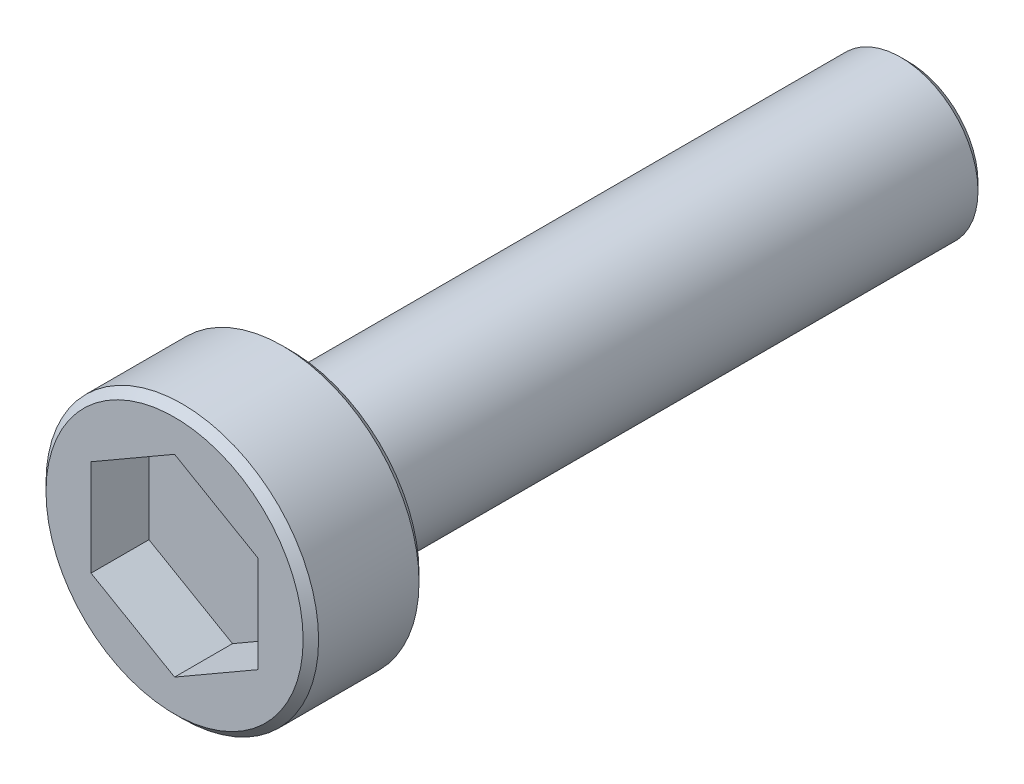
ISO-10303-21;
HEADER;
FILE_DESCRIPTION(('STEP AP214'),'2;1');
FILE_NAME('part.step','',(''),(''),'','','');
FILE_SCHEMA(('AUTOMOTIVE_DESIGN { 1 0 10303 214 1 1 1 1 }'));
ENDSEC;
DATA;
#1=APPLICATION_CONTEXT('core data for automotive mechanical design processes');
#2=APPLICATION_PROTOCOL_DEFINITION('international standard','automotive_design',2000,#1);
#3=PRODUCT_CONTEXT('',#1,'mechanical');
#4=PRODUCT('Part','Part','',(#3));
#5=PRODUCT_RELATED_PRODUCT_CATEGORY('part','',(#4));
#6=PRODUCT_DEFINITION_FORMATION('','',#4);
#7=PRODUCT_DEFINITION_CONTEXT('part definition',#1,'design');
#8=PRODUCT_DEFINITION('design','',#6,#7);
#9=PRODUCT_DEFINITION_SHAPE('','',#8);
#10=(LENGTH_UNIT() NAMED_UNIT(*) SI_UNIT(.MILLI.,.METRE.));
#11=(NAMED_UNIT(*) PLANE_ANGLE_UNIT() SI_UNIT($,.RADIAN.));
#12=(NAMED_UNIT(*) SI_UNIT($,.STERADIAN.) SOLID_ANGLE_UNIT());
#13=UNCERTAINTY_MEASURE_WITH_UNIT(LENGTH_MEASURE(1.E-05),#10,'distance_accuracy_value','');
#14=(GEOMETRIC_REPRESENTATION_CONTEXT(3) GLOBAL_UNCERTAINTY_ASSIGNED_CONTEXT((#13)) GLOBAL_UNIT_ASSIGNED_CONTEXT((#10,
#11,#12)) REPRESENTATION_CONTEXT('',''));
#15=CARTESIAN_POINT('',(0.,0.,0.));
#16=DIRECTION('',(0.,0.,1.));
#17=DIRECTION('',(1.,0.,0.));
#18=AXIS2_PLACEMENT_3D('',#15,#16,#17);
#19=CARTESIAN_POINT('',(0.,0.,16.));
#20=DIRECTION('',(0.,0.,-1.));
#21=DIRECTION('',(-1.,0.,0.));
#22=AXIS2_PLACEMENT_3D('',#19,#20,#21);
#23=CYLINDRICAL_SURFACE('',#22,2.);
#24=CARTESIAN_POINT('',(0.,0.,0.199999999999999));
#25=DIRECTION('',(0.,0.,1.));
#26=DIRECTION('',(1.,0.,0.));
#27=AXIS2_PLACEMENT_3D('',#24,#25,#26);
#28=CIRCLE('',#27,2.);
#29=CARTESIAN_POINT('',(2.,0.,0.199999999999999));
#30=VERTEX_POINT('',#29);
#31=EDGE_CURVE('E149',#30,#30,#28,.T.);
#32=ORIENTED_EDGE('',*,*,#31,.T.);
#33=EDGE_LOOP('',(#32));
#34=FACE_BOUND('',#33,.T.);
#35=CARTESIAN_POINT('',(0.,0.,16.));
#36=DIRECTION('',(0.,0.,1.));
#37=DIRECTION('',(1.,0.,0.));
#38=AXIS2_PLACEMENT_3D('',#35,#36,#37);
#39=CIRCLE('',#38,2.);
#40=CARTESIAN_POINT('',(2.,0.,16.));
#41=VERTEX_POINT('',#40);
#42=EDGE_CURVE('E141',#41,#41,#39,.T.);
#43=ORIENTED_EDGE('',*,*,#42,.F.);
#44=EDGE_LOOP('',(#43));
#45=FACE_BOUND('',#44,.T.);
#46=ADVANCED_FACE('F39',(#34,#45),#23,.T.);
#47=CARTESIAN_POINT('',(0.,0.,0.));
#48=DIRECTION('',(0.,0.,1.));
#49=DIRECTION('',(1.,0.,0.));
#50=AXIS2_PLACEMENT_3D('',#47,#48,#49);
#51=PLANE('',#50);
#52=CARTESIAN_POINT('',(0.,0.,0.));
#53=DIRECTION('',(0.,0.,1.));
#54=DIRECTION('',(1.,0.,0.));
#55=AXIS2_PLACEMENT_3D('',#52,#53,#54);
#56=CIRCLE('',#55,1.8);
#57=CARTESIAN_POINT('',(1.8,0.,0.));
#58=VERTEX_POINT('',#57);
#59=EDGE_CURVE('E152',#58,#58,#56,.F.);
#60=ORIENTED_EDGE('',*,*,#59,.T.);
#61=EDGE_LOOP('',(#60));
#62=FACE_BOUND('',#61,.T.);
#63=ADVANCED_FACE('F196',(#62),#51,.F.);
#64=CARTESIAN_POINT('',(0.,0.,19.));
#65=DIRECTION('',(0.,0.,-1.));
#66=DIRECTION('',(-1.,0.,0.));
#67=AXIS2_PLACEMENT_3D('',#64,#65,#66);
#68=CYLINDRICAL_SURFACE('',#67,3.52854216956388);
#69=CARTESIAN_POINT('',(0.,0.,18.8));
#70=DIRECTION('',(0.,0.,1.));
#71=DIRECTION('',(1.,0.,0.));
#72=AXIS2_PLACEMENT_3D('',#69,#70,#71);
#73=CIRCLE('',#72,3.52854216956388);
#74=CARTESIAN_POINT('',(3.52854216956388,0.,18.8));
#75=VERTEX_POINT('',#74);
#76=EDGE_CURVE('E47',#75,#75,#73,.F.);
#77=ORIENTED_EDGE('',*,*,#76,.T.);
#78=EDGE_LOOP('',(#77));
#79=FACE_BOUND('',#78,.T.);
#80=CARTESIAN_POINT('',(0.,0.,16.2));
#81=DIRECTION('',(0.,0.,1.));
#82=DIRECTION('',(1.,0.,0.));
#83=AXIS2_PLACEMENT_3D('',#80,#81,#82);
#84=CIRCLE('',#83,3.52854216956388);
#85=CARTESIAN_POINT('',(3.52854216956388,0.,16.2));
#86=VERTEX_POINT('',#85);
#87=EDGE_CURVE('E158',#86,#86,#84,.T.);
#88=ORIENTED_EDGE('',*,*,#87,.T.);
#89=EDGE_LOOP('',(#88));
#90=FACE_BOUND('',#89,.T.);
#91=ADVANCED_FACE('F163',(#79,#90),#68,.T.);
#92=CARTESIAN_POINT('',(0.,0.,19.));
#93=DIRECTION('',(0.,0.,1.));
#94=DIRECTION('',(1.,0.,0.));
#95=AXIS2_PLACEMENT_3D('',#92,#93,#94);
#96=PLANE('',#95);
#97=CARTESIAN_POINT('',(0.,0.,19.));
#98=DIRECTION('',(0.,0.,1.));
#99=DIRECTION('',(1.,0.,0.));
#100=AXIS2_PLACEMENT_3D('',#97,#98,#99);
#101=CIRCLE('',#100,3.32854216956388);
#102=CARTESIAN_POINT('',(3.32854216956388,0.,19.));
#103=VERTEX_POINT('',#102);
#104=EDGE_CURVE('E155',#103,#103,#101,.T.);
#105=ORIENTED_EDGE('',*,*,#104,.T.);
#106=EDGE_LOOP('',(#105));
#107=FACE_BOUND('',#106,.T.);
#108=DIRECTION('',(-0.866025403784441,0.499999999999995,0.));
#109=VECTOR('',#108,1.);
#110=CARTESIAN_POINT('',(2.16306090746615,1.24884379719917,19.));
#111=LINE('',#110,#109);
#112=CARTESIAN_POINT('',(2.16306090746615,1.24884379719917,19.));
#113=VERTEX_POINT('',#112);
#114=CARTESIAN_POINT('',(0.,2.49768759439829,19.));
#115=VERTEX_POINT('',#114);
#116=EDGE_CURVE('E54',#113,#115,#111,.T.);
#117=ORIENTED_EDGE('',*,*,#116,.F.);
#118=DIRECTION('',(0.,1.,0.));
#119=VECTOR('',#118,1.);
#120=CARTESIAN_POINT('',(2.16306090746617,-1.24884379719912,19.));
#121=LINE('',#120,#119);
#122=CARTESIAN_POINT('',(2.16306090746617,-1.24884379719912,19.));
#123=VERTEX_POINT('',#122);
#124=EDGE_CURVE('E137',#123,#113,#121,.T.);
#125=ORIENTED_EDGE('',*,*,#124,.F.);
#126=DIRECTION('',(0.866025403784435,0.500000000000007,0.));
#127=VECTOR('',#126,1.);
#128=CARTESIAN_POINT('',(0.,-2.49768759439829,19.));
#129=LINE('',#128,#127);
#130=CARTESIAN_POINT('',(0.,-2.49768759439829,19.));
#131=VERTEX_POINT('',#130);
#132=EDGE_CURVE('E135',#131,#123,#129,.T.);
#133=ORIENTED_EDGE('',*,*,#132,.F.);
#134=DIRECTION('',(0.866025403784442,-0.499999999999995,0.));
#135=VECTOR('',#134,1.);
#136=CARTESIAN_POINT('',(-2.16306090746615,-1.24884379719915,19.));
#137=LINE('',#136,#135);
#138=CARTESIAN_POINT('',(-2.16306090746615,-1.24884379719915,19.));
#139=VERTEX_POINT('',#138);
#140=EDGE_CURVE('E102',#139,#131,#137,.T.);
#141=ORIENTED_EDGE('',*,*,#140,.F.);
#142=DIRECTION('',(0.,-1.,0.));
#143=VECTOR('',#142,1.);
#144=CARTESIAN_POINT('',(-2.16306090746616,1.24884379719914,19.));
#145=LINE('',#144,#143);
#146=CARTESIAN_POINT('',(-2.16306090746616,1.24884379719914,19.));
#147=VERTEX_POINT('',#146);
#148=EDGE_CURVE('E131',#147,#139,#145,.T.);
#149=ORIENTED_EDGE('',*,*,#148,.F.);
#150=DIRECTION('',(-0.866025403784438,-0.500000000000001,0.));
#151=VECTOR('',#150,1.);
#152=CARTESIAN_POINT('',(0.,2.49768759439829,19.));
#153=LINE('',#152,#151);
#154=EDGE_CURVE('E128',#115,#147,#153,.T.);
#155=ORIENTED_EDGE('',*,*,#154,.F.);
#156=EDGE_LOOP('',(#117,#125,#133,#141,#149,#155));
#157=FACE_BOUND('',#156,.T.);
#158=ADVANCED_FACE('F172',(#107,#157),#96,.T.);
#159=CARTESIAN_POINT('',(0.,0.,16.));
#160=DIRECTION('',(0.,0.,1.));
#161=DIRECTION('',(1.,0.,0.));
#162=AXIS2_PLACEMENT_3D('',#159,#160,#161);
#163=PLANE('',#162);
#164=CARTESIAN_POINT('',(0.,0.,16.));
#165=DIRECTION('',(0.,0.,1.));
#166=DIRECTION('',(1.,0.,0.));
#167=AXIS2_PLACEMENT_3D('',#164,#165,#166);
#168=CIRCLE('',#167,3.32854216956388);
#169=CARTESIAN_POINT('',(3.32854216956388,0.,16.));
#170=VERTEX_POINT('',#169);
#171=EDGE_CURVE('E11',#170,#170,#168,.F.);
#172=ORIENTED_EDGE('',*,*,#171,.T.);
#173=EDGE_LOOP('',(#172));
#174=FACE_BOUND('',#173,.T.);
#175=ORIENTED_EDGE('',*,*,#42,.T.);
#176=EDGE_LOOP('',(#175));
#177=FACE_BOUND('',#176,.T.);
#178=ADVANCED_FACE('F175',(#174,#177),#163,.F.);
#179=CARTESIAN_POINT('',(2.16306090746615,1.24884379719917,17.5));
#180=DIRECTION('',(0.499999999999995,0.866025403784442,0.));
#181=DIRECTION('',(-0.866025403784442,0.499999999999995,0.));
#182=AXIS2_PLACEMENT_3D('',#179,#180,#181);
#183=PLANE('',#182);
#184=ORIENTED_EDGE('',*,*,#116,.T.);
#185=DIRECTION('',(0.,0.,1.));
#186=VECTOR('',#185,1.);
#187=CARTESIAN_POINT('',(0.,2.49768759439829,17.5));
#188=LINE('',#187,#186);
#189=CARTESIAN_POINT('',(0.,2.49768759439829,17.5));
#190=VERTEX_POINT('',#189);
#191=EDGE_CURVE('E84',#190,#115,#188,.T.);
#192=ORIENTED_EDGE('',*,*,#191,.F.);
#193=DIRECTION('',(-0.866025403784441,0.499999999999995,0.));
#194=VECTOR('',#193,1.);
#195=CARTESIAN_POINT('',(2.16306090746615,1.24884379719917,17.5));
#196=LINE('',#195,#194);
#197=CARTESIAN_POINT('',(2.16306090746615,1.24884379719917,17.5));
#198=VERTEX_POINT('',#197);
#199=EDGE_CURVE('E139',#198,#190,#196,.T.);
#200=ORIENTED_EDGE('',*,*,#199,.F.);
#201=DIRECTION('',(0.,0.,1.));
#202=VECTOR('',#201,1.);
#203=CARTESIAN_POINT('',(2.16306090746615,1.24884379719917,17.5));
#204=LINE('',#203,#202);
#205=EDGE_CURVE('E62',#198,#113,#204,.T.);
#206=ORIENTED_EDGE('',*,*,#205,.T.);
#207=EDGE_LOOP('',(#184,#192,#200,#206));
#208=FACE_BOUND('',#207,.T.);
#209=ADVANCED_FACE('F183',(#208),#183,.F.);
#210=CARTESIAN_POINT('',(2.16306090746617,-1.24884379719912,17.5));
#211=DIRECTION('',(1.,0.,0.));
#212=DIRECTION('',(0.,1.,0.));
#213=AXIS2_PLACEMENT_3D('',#210,#211,#212);
#214=PLANE('',#213);
#215=ORIENTED_EDGE('',*,*,#124,.T.);
#216=ORIENTED_EDGE('',*,*,#205,.F.);
#217=DIRECTION('',(0.,1.,0.));
#218=VECTOR('',#217,1.);
#219=CARTESIAN_POINT('',(2.16306090746617,-1.24884379719912,17.5));
#220=LINE('',#219,#218);
#221=CARTESIAN_POINT('',(2.16306090746617,-1.24884379719912,17.5));
#222=VERTEX_POINT('',#221);
#223=EDGE_CURVE('E114',#222,#198,#220,.T.);
#224=ORIENTED_EDGE('',*,*,#223,.F.);
#225=DIRECTION('',(0.,0.,1.));
#226=VECTOR('',#225,1.);
#227=CARTESIAN_POINT('',(2.16306090746617,-1.24884379719912,17.5));
#228=LINE('',#227,#226);
#229=EDGE_CURVE('E106',#222,#123,#228,.T.);
#230=ORIENTED_EDGE('',*,*,#229,.T.);
#231=EDGE_LOOP('',(#215,#216,#224,#230));
#232=FACE_BOUND('',#231,.T.);
#233=ADVANCED_FACE('F185',(#232),#214,.F.);
#234=CARTESIAN_POINT('',(0.,-2.49768759439829,17.5));
#235=DIRECTION('',(0.500000000000007,-0.866025403784434,0.));
#236=DIRECTION('',(0.866025403784435,0.500000000000007,0.));
#237=AXIS2_PLACEMENT_3D('',#234,#235,#236);
#238=PLANE('',#237);
#239=ORIENTED_EDGE('',*,*,#132,.T.);
#240=ORIENTED_EDGE('',*,*,#229,.F.);
#241=DIRECTION('',(0.866025403784435,0.500000000000007,0.));
#242=VECTOR('',#241,1.);
#243=CARTESIAN_POINT('',(0.,-2.49768759439829,17.5));
#244=LINE('',#243,#242);
#245=CARTESIAN_POINT('',(0.,-2.49768759439829,17.5));
#246=VERTEX_POINT('',#245);
#247=EDGE_CURVE('E110',#246,#222,#244,.T.);
#248=ORIENTED_EDGE('',*,*,#247,.F.);
#249=DIRECTION('',(0.,0.,1.));
#250=VECTOR('',#249,1.);
#251=CARTESIAN_POINT('',(0.,-2.49768759439829,17.5));
#252=LINE('',#251,#250);
#253=EDGE_CURVE('E95',#246,#131,#252,.T.);
#254=ORIENTED_EDGE('',*,*,#253,.T.);
#255=EDGE_LOOP('',(#239,#240,#248,#254));
#256=FACE_BOUND('',#255,.T.);
#257=ADVANCED_FACE('F111',(#256),#238,.F.);
#258=CARTESIAN_POINT('',(-2.16306090746615,-1.24884379719915,17.5));
#259=DIRECTION('',(-0.499999999999995,-0.866025403784441,0.));
#260=DIRECTION('',(0.866025403784442,-0.499999999999995,0.));
#261=AXIS2_PLACEMENT_3D('',#258,#259,#260);
#262=PLANE('',#261);
#263=ORIENTED_EDGE('',*,*,#140,.T.);
#264=ORIENTED_EDGE('',*,*,#253,.F.);
#265=DIRECTION('',(0.866025403784442,-0.499999999999995,0.));
#266=VECTOR('',#265,1.);
#267=CARTESIAN_POINT('',(-2.16306090746615,-1.24884379719915,17.5));
#268=LINE('',#267,#266);
#269=CARTESIAN_POINT('',(-2.16306090746615,-1.24884379719915,17.5));
#270=VERTEX_POINT('',#269);
#271=EDGE_CURVE('E99',#270,#246,#268,.T.);
#272=ORIENTED_EDGE('',*,*,#271,.F.);
#273=DIRECTION('',(0.,0.,1.));
#274=VECTOR('',#273,1.);
#275=CARTESIAN_POINT('',(-2.16306090746615,-1.24884379719915,17.5));
#276=LINE('',#275,#274);
#277=EDGE_CURVE('E107',#270,#139,#276,.T.);
#278=ORIENTED_EDGE('',*,*,#277,.T.);
#279=EDGE_LOOP('',(#263,#264,#272,#278));
#280=FACE_BOUND('',#279,.T.);
#281=ADVANCED_FACE('F97',(#280),#262,.F.);
#282=CARTESIAN_POINT('',(-2.16306090746616,1.24884379719914,17.5));
#283=DIRECTION('',(-1.,0.,0.));
#284=DIRECTION('',(0.,-1.,0.));
#285=AXIS2_PLACEMENT_3D('',#282,#283,#284);
#286=PLANE('',#285);
#287=ORIENTED_EDGE('',*,*,#148,.T.);
#288=ORIENTED_EDGE('',*,*,#277,.F.);
#289=DIRECTION('',(0.,-1.,0.));
#290=VECTOR('',#289,1.);
#291=CARTESIAN_POINT('',(-2.16306090746616,1.24884379719914,17.5));
#292=LINE('',#291,#290);
#293=CARTESIAN_POINT('',(-2.16306090746616,1.24884379719914,17.5));
#294=VERTEX_POINT('',#293);
#295=EDGE_CURVE('E120',#294,#270,#292,.T.);
#296=ORIENTED_EDGE('',*,*,#295,.F.);
#297=DIRECTION('',(0.,0.,1.));
#298=VECTOR('',#297,1.);
#299=CARTESIAN_POINT('',(-2.16306090746616,1.24884379719914,17.5));
#300=LINE('',#299,#298);
#301=EDGE_CURVE('E144',#294,#147,#300,.T.);
#302=ORIENTED_EDGE('',*,*,#301,.T.);
#303=EDGE_LOOP('',(#287,#288,#296,#302));
#304=FACE_BOUND('',#303,.T.);
#305=ADVANCED_FACE('F219',(#304),#286,.F.);
#306=CARTESIAN_POINT('',(0.,2.49768759439829,17.5));
#307=DIRECTION('',(-0.500000000000001,0.866025403784438,0.));
#308=DIRECTION('',(-0.866025403784438,-0.500000000000001,0.));
#309=AXIS2_PLACEMENT_3D('',#306,#307,#308);
#310=PLANE('',#309);
#311=ORIENTED_EDGE('',*,*,#154,.T.);
#312=ORIENTED_EDGE('',*,*,#301,.F.);
#313=DIRECTION('',(-0.866025403784438,-0.500000000000001,0.));
#314=VECTOR('',#313,1.);
#315=CARTESIAN_POINT('',(0.,2.49768759439829,17.5));
#316=LINE('',#315,#314);
#317=EDGE_CURVE('E122',#190,#294,#316,.T.);
#318=ORIENTED_EDGE('',*,*,#317,.F.);
#319=ORIENTED_EDGE('',*,*,#191,.T.);
#320=EDGE_LOOP('',(#311,#312,#318,#319));
#321=FACE_BOUND('',#320,.T.);
#322=ADVANCED_FACE('F181',(#321),#310,.F.);
#323=CARTESIAN_POINT('',(0.,0.,17.5));
#324=DIRECTION('',(0.,0.,1.));
#325=DIRECTION('',(1.,0.,0.));
#326=AXIS2_PLACEMENT_3D('',#323,#324,#325);
#327=PLANE('',#326);
#328=ORIENTED_EDGE('',*,*,#199,.T.);
#329=ORIENTED_EDGE('',*,*,#317,.T.);
#330=ORIENTED_EDGE('',*,*,#295,.T.);
#331=ORIENTED_EDGE('',*,*,#271,.T.);
#332=ORIENTED_EDGE('',*,*,#247,.T.);
#333=ORIENTED_EDGE('',*,*,#223,.T.);
#334=EDGE_LOOP('',(#328,#329,#330,#331,#332,#333));
#335=FACE_BOUND('',#334,.T.);
#336=ADVANCED_FACE('F117',(#335),#327,.T.);
#337=CARTESIAN_POINT('',(0.,0.,0.199999999999999));
#338=DIRECTION('',(0.,0.,1.));
#339=DIRECTION('',(1.,0.,0.));
#340=AXIS2_PLACEMENT_3D('',#337,#338,#339);
#341=CONICAL_SURFACE('',#340,2.,0.785398163397457);
#342=ORIENTED_EDGE('',*,*,#59,.F.);
#343=EDGE_LOOP('',(#342));
#344=FACE_BOUND('',#343,.T.);
#345=ORIENTED_EDGE('',*,*,#31,.F.);
#346=EDGE_LOOP('',(#345));
#347=FACE_BOUND('',#346,.T.);
#348=ADVANCED_FACE('F169',(#344,#347),#341,.T.);
#349=CARTESIAN_POINT('',(0.,0.,19.));
#350=DIRECTION('',(0.,0.,-1.));
#351=DIRECTION('',(-1.,0.,0.));
#352=AXIS2_PLACEMENT_3D('',#349,#350,#351);
#353=CONICAL_SURFACE('',#352,3.32854216956388,0.785398163397436);
#354=ORIENTED_EDGE('',*,*,#76,.F.);
#355=EDGE_LOOP('',(#354));
#356=FACE_BOUND('',#355,.T.);
#357=ORIENTED_EDGE('',*,*,#104,.F.);
#358=EDGE_LOOP('',(#357));
#359=FACE_BOUND('',#358,.T.);
#360=ADVANCED_FACE('F166',(#356,#359),#353,.T.);
#361=CARTESIAN_POINT('',(0.,0.,16.2));
#362=DIRECTION('',(0.,0.,1.));
#363=DIRECTION('',(1.,0.,0.));
#364=AXIS2_PLACEMENT_3D('',#361,#362,#363);
#365=CONICAL_SURFACE('',#364,3.52854216956388,0.785398163397446);
#366=ORIENTED_EDGE('',*,*,#171,.F.);
#367=EDGE_LOOP('',(#366));
#368=FACE_BOUND('',#367,.T.);
#369=ORIENTED_EDGE('',*,*,#87,.F.);
#370=EDGE_LOOP('',(#369));
#371=FACE_BOUND('',#370,.T.);
#372=ADVANCED_FACE('F41',(#368,#371),#365,.T.);
#373=CLOSED_SHELL('',(#46,#63,#91,#158,#178,#209,#233,#257,#281,#305,#322,#336,#348,#360,#372));
#374=MANIFOLD_SOLID_BREP('B2',#373);
#375=ADVANCED_BREP_SHAPE_REPRESENTATION('',(#18,#374),#14);
#376=SHAPE_DEFINITION_REPRESENTATION(#9,#375);
ENDSEC;
END-ISO-10303-21;
